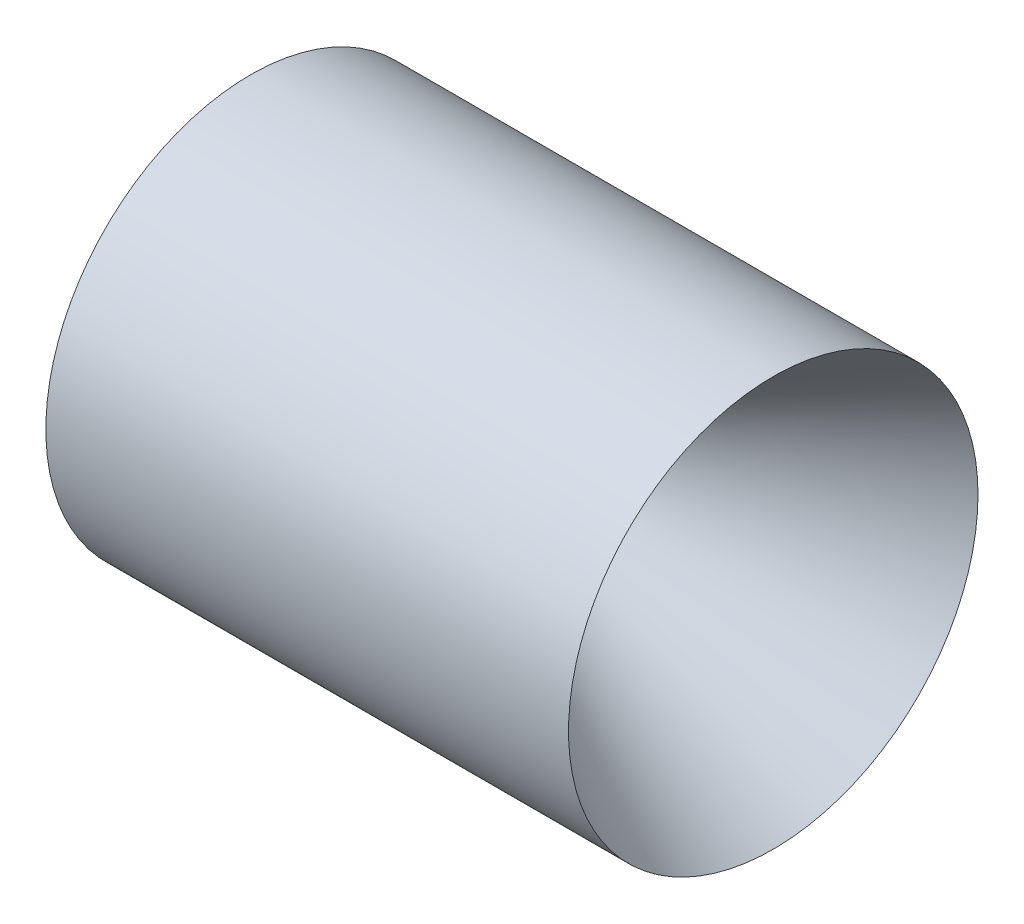
ISO-10303-21;
HEADER;
FILE_DESCRIPTION(('STEP AP214'),'2;1');
FILE_NAME('part.step','',(''),(''),'','','');
FILE_SCHEMA(('AUTOMOTIVE_DESIGN { 1 0 10303 214 1 1 1 1 }'));
ENDSEC;
DATA;
#1=APPLICATION_CONTEXT('core data for automotive mechanical design processes');
#2=APPLICATION_PROTOCOL_DEFINITION('international standard','automotive_design',2000,#1);
#3=PRODUCT_CONTEXT('',#1,'mechanical');
#4=PRODUCT('Part','Part','',(#3));
#5=PRODUCT_RELATED_PRODUCT_CATEGORY('part','',(#4));
#6=PRODUCT_DEFINITION_FORMATION('','',#4);
#7=PRODUCT_DEFINITION_CONTEXT('part definition',#1,'design');
#8=PRODUCT_DEFINITION('design','',#6,#7);
#9=PRODUCT_DEFINITION_SHAPE('','',#8);
#10=(LENGTH_UNIT() NAMED_UNIT(*) SI_UNIT(.MILLI.,.METRE.));
#11=(NAMED_UNIT(*) PLANE_ANGLE_UNIT() SI_UNIT($,.RADIAN.));
#12=(NAMED_UNIT(*) SI_UNIT($,.STERADIAN.) SOLID_ANGLE_UNIT());
#13=UNCERTAINTY_MEASURE_WITH_UNIT(LENGTH_MEASURE(1.E-05),#10,'distance_accuracy_value','');
#14=(GEOMETRIC_REPRESENTATION_CONTEXT(3) GLOBAL_UNCERTAINTY_ASSIGNED_CONTEXT((#13)) GLOBAL_UNIT_ASSIGNED_CONTEXT((#10,
#11,#12)) REPRESENTATION_CONTEXT('',''));
#15=CARTESIAN_POINT('',(0.,0.,0.));
#16=DIRECTION('',(0.,0.,1.));
#17=DIRECTION('',(1.,0.,0.));
#18=AXIS2_PLACEMENT_3D('',#15,#16,#17);
#19=CARTESIAN_POINT('',(-85.9727711955575,10.9625922203707,0.));
#20=DIRECTION('',(-1.,0.,0.));
#21=DIRECTION('',(0.,0.,1.));
#22=AXIS2_PLACEMENT_3D('',#19,#20,#21);
#23=PLANE('',#22);
#24=CARTESIAN_POINT('',(-85.9727711955575,0.,0.));
#25=DIRECTION('',(1.,0.,0.));
#26=DIRECTION('',(0.,0.,-1.));
#27=AXIS2_PLACEMENT_3D('',#24,#25,#26);
#28=CIRCLE('',#27,10.9625922203707);
#29=CARTESIAN_POINT('',(-85.9727711955575,0.,-10.9625922203707));
#30=VERTEX_POINT('',#29);
#31=EDGE_CURVE('E51',#30,#30,#28,.T.);
#32=ORIENTED_EDGE('',*,*,#31,.T.);
#33=EDGE_LOOP('',(#32));
#34=FACE_BOUND('',#33,.T.);
#35=CARTESIAN_POINT('',(-85.9727711955575,0.,0.));
#36=DIRECTION('',(1.,0.,0.));
#37=DIRECTION('',(0.,0.,-1.));
#38=AXIS2_PLACEMENT_3D('',#35,#36,#37);
#39=CIRCLE('',#38,17.5);
#40=CARTESIAN_POINT('',(-85.9727711955575,0.,-17.5));
#41=VERTEX_POINT('',#40);
#42=EDGE_CURVE('E10',#41,#41,#39,.T.);
#43=ORIENTED_EDGE('',*,*,#42,.F.);
#44=EDGE_LOOP('',(#43));
#45=FACE_BOUND('',#44,.T.);
#46=ADVANCED_FACE('F32',(#34,#45),#23,.T.);
#47=CARTESIAN_POINT('',(11.2723845428841,0.,0.));
#48=DIRECTION('',(1.,0.,0.));
#49=DIRECTION('',(0.,0.,-1.));
#50=AXIS2_PLACEMENT_3D('',#47,#48,#49);
#51=CYLINDRICAL_SURFACE('',#50,17.5);
#52=ORIENTED_EDGE('',*,*,#42,.T.);
#53=EDGE_LOOP('',(#52));
#54=FACE_BOUND('',#53,.T.);
#55=CARTESIAN_POINT('',(-41.2963754317963,0.,0.));
#56=DIRECTION('',(1.,0.,0.));
#57=DIRECTION('',(0.,0.,-1.));
#58=AXIS2_PLACEMENT_3D('',#55,#56,#57);
#59=CIRCLE('',#58,17.5);
#60=CARTESIAN_POINT('',(-41.2963754317963,0.,-17.5));
#61=VERTEX_POINT('',#60);
#62=EDGE_CURVE('E38',#61,#61,#59,.T.);
#63=ORIENTED_EDGE('',*,*,#62,.F.);
#64=EDGE_LOOP('',(#63));
#65=FACE_BOUND('',#64,.T.);
#66=ADVANCED_FACE('F69',(#54,#65),#51,.T.);
#67=CARTESIAN_POINT('',(-62.9470105264076,0.,0.));
#68=DIRECTION('',(1.,0.,0.));
#69=DIRECTION('',(0.,0.,-1.));
#70=AXIS2_PLACEMENT_3D('',#67,#68,#69);
#71=CONICAL_SURFACE('',#70,5.,0.523598775598293);
#72=CARTESIAN_POINT('',(-62.9470105264076,0.,0.));
#73=DIRECTION('',(1.,0.,0.));
#74=DIRECTION('',(0.,0.,-1.));
#75=AXIS2_PLACEMENT_3D('',#72,#73,#74);
#76=CIRCLE('',#75,5.);
#77=CARTESIAN_POINT('',(-62.9470105264076,0.,-4.99999999999999));
#78=VERTEX_POINT('',#77);
#79=EDGE_CURVE('E42',#78,#78,#76,.T.);
#80=CARTESIAN_POINT('',(-41.2963754317963,0.,-17.5));
#81=CARTESIAN_POINT('',(-41.5219028806986,0.,-17.3697916666667));
#82=CARTESIAN_POINT('',(-41.7474303296008,0.,-17.2395833333333));
#83=CARTESIAN_POINT('',(-42.1984852274052,0.,-16.9791666666667));
#84=CARTESIAN_POINT('',(-42.4240126763074,0.,-16.8489583333333));
#85=CARTESIAN_POINT('',(-42.8750675741118,0.,-16.5885416666667));
#86=CARTESIAN_POINT('',(-43.100595023014,0.,-16.4583333333333));
#87=CARTESIAN_POINT('',(-43.5516499208184,0.,-16.1979166666667));
#88=CARTESIAN_POINT('',(-43.7771773697206,0.,-16.0677083333333));
#89=CARTESIAN_POINT('',(-44.228232267525,0.,-15.8072916666667));
#90=CARTESIAN_POINT('',(-44.4537597164272,0.,-15.6770833333333));
#91=CARTESIAN_POINT('',(-44.9048146142316,0.,-15.4166666666667));
#92=CARTESIAN_POINT('',(-45.1303420631338,0.,-15.2864583333333));
#93=CARTESIAN_POINT('',(-45.5813969609382,0.,-15.0260416666667));
#94=CARTESIAN_POINT('',(-45.8069244098404,0.,-14.8958333333333));
#95=CARTESIAN_POINT('',(-46.2579793076448,0.,-14.6354166666667));
#96=CARTESIAN_POINT('',(-46.483506756547,0.,-14.5052083333333));
#97=CARTESIAN_POINT('',(-46.9345616543514,0.,-14.2447916666667));
#98=CARTESIAN_POINT('',(-47.1600891032536,0.,-14.1145833333333));
#99=CARTESIAN_POINT('',(-47.611144001058,0.,-13.8541666666667));
#100=CARTESIAN_POINT('',(-47.8366714499602,0.,-13.7239583333333));
#101=CARTESIAN_POINT('',(-48.2877263477646,0.,-13.4635416666667));
#102=CARTESIAN_POINT('',(-48.5132537966668,0.,-13.3333333333333));
#103=CARTESIAN_POINT('',(-48.9643086944712,0.,-13.0729166666667));
#104=CARTESIAN_POINT('',(-49.1898361433734,0.,-12.9427083333333));
#105=CARTESIAN_POINT('',(-49.6408910411778,0.,-12.6822916666667));
#106=CARTESIAN_POINT('',(-49.86641849008,0.,-12.5520833333333));
#107=CARTESIAN_POINT('',(-50.3174733878844,0.,-12.2916666666667));
#108=CARTESIAN_POINT('',(-50.5430008367866,0.,-12.1614583333333));
#109=CARTESIAN_POINT('',(-50.994055734591,0.,-11.9010416666667));
#110=CARTESIAN_POINT('',(-51.2195831834932,0.,-11.7708333333333));
#111=CARTESIAN_POINT('',(-51.6706380812976,0.,-11.5104166666667));
#112=CARTESIAN_POINT('',(-51.8961655301998,0.,-11.3802083333333));
#113=CARTESIAN_POINT('',(-52.3472204280042,0.,-11.1197916666667));
#114=CARTESIAN_POINT('',(-52.5727478769064,0.,-10.9895833333333));
#115=CARTESIAN_POINT('',(-53.0238027747108,0.,-10.7291666666667));
#116=CARTESIAN_POINT('',(-53.249330223613,0.,-10.5989583333333));
#117=CARTESIAN_POINT('',(-53.7003851214174,0.,-10.3385416666667));
#118=CARTESIAN_POINT('',(-53.9259125703196,0.,-10.2083333333333));
#119=CARTESIAN_POINT('',(-54.376967468124,0.,-9.94791666666666));
#120=CARTESIAN_POINT('',(-54.6024949170262,0.,-9.81770833333332));
#121=CARTESIAN_POINT('',(-55.0535498148306,0.,-9.55729166666666));
#122=CARTESIAN_POINT('',(-55.2790772637328,0.,-9.42708333333333));
#123=CARTESIAN_POINT('',(-55.7301321615372,0.,-9.16666666666666));
#124=CARTESIAN_POINT('',(-55.9556596104394,0.,-9.03645833333333));
#125=CARTESIAN_POINT('',(-56.4067145082438,0.,-8.77604166666666));
#126=CARTESIAN_POINT('',(-56.632241957146,0.,-8.64583333333333));
#127=CARTESIAN_POINT('',(-57.0832968549504,0.,-8.38541666666666));
#128=CARTESIAN_POINT('',(-57.3088243038526,0.,-8.25520833333333));
#129=CARTESIAN_POINT('',(-57.759879201657,0.,-7.99479166666666));
#130=CARTESIAN_POINT('',(-57.9854066505592,0.,-7.86458333333332));
#131=CARTESIAN_POINT('',(-58.4364615483636,0.,-7.60416666666666));
#132=CARTESIAN_POINT('',(-58.6619889972658,0.,-7.47395833333332));
#133=CARTESIAN_POINT('',(-59.1130438950702,0.,-7.21354166666666));
#134=CARTESIAN_POINT('',(-59.3385713439724,0.,-7.08333333333333));
#135=CARTESIAN_POINT('',(-59.7896262417768,0.,-6.82291666666666));
#136=CARTESIAN_POINT('',(-60.015153690679,0.,-6.69270833333333));
#137=CARTESIAN_POINT('',(-60.4662085884834,0.,-6.43229166666666));
#138=CARTESIAN_POINT('',(-60.6917360373856,0.,-6.30208333333333));
#139=CARTESIAN_POINT('',(-61.14279093519,0.,-6.04166666666666));
#140=CARTESIAN_POINT('',(-61.3683183840922,0.,-5.91145833333333));
#141=CARTESIAN_POINT('',(-61.8193732818966,0.,-5.65104166666666));
#142=CARTESIAN_POINT('',(-62.0449007307988,0.,-5.52083333333333));
#143=CARTESIAN_POINT('',(-62.4959556286032,0.,-5.26041666666666));
#144=CARTESIAN_POINT('',(-62.7214830775054,0.,-5.13020833333333));
#145=CARTESIAN_POINT('',(-62.9470105264076,0.,-4.99999999999999));
#146=B_SPLINE_CURVE_WITH_KNOTS('',3,(#80,#81,#82,#83,#84,#85,#86,#87,#88,#89,#90,#91,#92,#93,
#94,#95,#96,#97,#98,#99,#100,#101,#102,#103,#104,#105,#106,#107,#108,#109,#110,#111,#112,#113,
#114,#115,#116,#117,#118,#119,#120,#121,#122,#123,#124,#125,#126,#127,#128,#129,#130,#131,#132,
#133,#134,#135,#136,#137,#138,#139,#140,#141,#142,#143,#144,#145),.UNSPECIFIED.,.F.,.F.,(4,2,2,
2,2,2,2,2,2,2,2,2,2,2,2,2,2,2,2,2,2,2,2,2,2,2,2,2,2,2,2,2,4),(0.,0.78125000000001,
1.56250000000002,2.34375000000002,3.12500000000003,3.90625000000004,4.68750000000005,
5.46875000000006,6.25000000000007,7.03125000000008,7.81250000000008,8.59375000000009,
9.3750000000001,10.1562500000001,10.9375000000001,11.7187500000001,12.5000000000001,
13.2812500000001,14.0625000000001,14.8437500000002,15.6250000000002,16.4062500000002,
17.1875000000002,17.9687500000002,18.7500000000002,19.5312500000002,20.3125000000002,
21.0937500000002,21.8750000000002,22.6562500000002,23.4375000000002,24.2187500000002,
25.0000000000002),.UNSPECIFIED.);
#147=EDGE_CURVE('BSEAM65',#61,#78,#146,.T.);
#148=ORIENTED_EDGE('',*,*,#62,.T.);
#149=ORIENTED_EDGE('',*,*,#79,.F.);
#150=ORIENTED_EDGE('',*,*,#147,.T.);
#151=ORIENTED_EDGE('',*,*,#147,.F.);
#152=EDGE_LOOP('',(#148,#150,#149,#151));
#153=FACE_BOUND('',#152,.T.);
#154=ADVANCED_FACE('F65',(#153),#71,.F.);
#155=CARTESIAN_POINT('',(11.2723845428841,0.,0.));
#156=DIRECTION('',(1.,0.,0.));
#157=DIRECTION('',(0.,0.,-1.));
#158=AXIS2_PLACEMENT_3D('',#155,#156,#157);
#159=CYLINDRICAL_SURFACE('',#158,5.);
#160=ORIENTED_EDGE('',*,*,#79,.T.);
#161=EDGE_LOOP('',(#160));
#162=FACE_BOUND('',#161,.T.);
#163=CARTESIAN_POINT('',(-63.7200740843191,0.,0.));
#164=DIRECTION('',(1.,0.,0.));
#165=DIRECTION('',(0.,0.,-1.));
#166=AXIS2_PLACEMENT_3D('',#163,#164,#165);
#167=CIRCLE('',#166,5.);
#168=CARTESIAN_POINT('',(-63.7200740843191,0.,-5.));
#169=VERTEX_POINT('',#168);
#170=EDGE_CURVE('E46',#169,#169,#167,.T.);
#171=ORIENTED_EDGE('',*,*,#170,.F.);
#172=EDGE_LOOP('',(#171));
#173=FACE_BOUND('',#172,.T.);
#174=ADVANCED_FACE('F59',(#162,#173),#159,.F.);
#175=CARTESIAN_POINT('',(-85.9727711955575,0.,0.));
#176=DIRECTION('',(-1.,0.,0.));
#177=DIRECTION('',(0.,0.,1.));
#178=AXIS2_PLACEMENT_3D('',#175,#176,#177);
#179=CONICAL_SURFACE('',#178,10.9625922203707,0.26179938779915);
#180=ORIENTED_EDGE('',*,*,#170,.T.);
#181=EDGE_LOOP('',(#180));
#182=FACE_BOUND('',#181,.T.);
#183=ORIENTED_EDGE('',*,*,#31,.F.);
#184=EDGE_LOOP('',(#183));
#185=FACE_BOUND('',#184,.T.);
#186=ADVANCED_FACE('F57',(#182,#185),#179,.F.);
#187=CLOSED_SHELL('',(#46,#66,#154,#174,#186));
#188=MANIFOLD_SOLID_BREP('B2',#187);
#189=ADVANCED_BREP_SHAPE_REPRESENTATION('',(#18,#188),#14);
#190=SHAPE_DEFINITION_REPRESENTATION(#9,#189);
ENDSEC;
END-ISO-10303-21;
